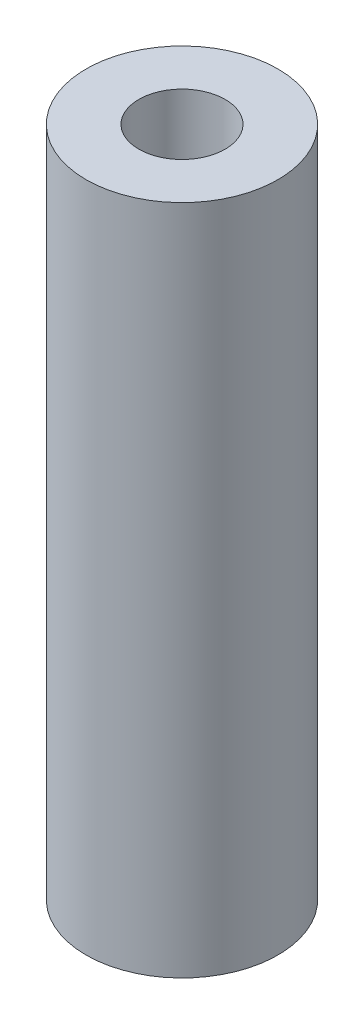
ISO-10303-21;
HEADER;
FILE_DESCRIPTION(('STEP AP214'),'2;1');
FILE_NAME('part.step','',(''),(''),'','','');
FILE_SCHEMA(('AUTOMOTIVE_DESIGN { 1 0 10303 214 1 1 1 1 }'));
ENDSEC;
DATA;
#1=APPLICATION_CONTEXT('core data for automotive mechanical design processes');
#2=APPLICATION_PROTOCOL_DEFINITION('international standard','automotive_design',2000,#1);
#3=PRODUCT_CONTEXT('',#1,'mechanical');
#4=PRODUCT('Part','Part','',(#3));
#5=PRODUCT_RELATED_PRODUCT_CATEGORY('part','',(#4));
#6=PRODUCT_DEFINITION_FORMATION('','',#4);
#7=PRODUCT_DEFINITION_CONTEXT('part definition',#1,'design');
#8=PRODUCT_DEFINITION('design','',#6,#7);
#9=PRODUCT_DEFINITION_SHAPE('','',#8);
#10=(LENGTH_UNIT() NAMED_UNIT(*) SI_UNIT(.MILLI.,.METRE.));
#11=(NAMED_UNIT(*) PLANE_ANGLE_UNIT() SI_UNIT($,.RADIAN.));
#12=(NAMED_UNIT(*) SI_UNIT($,.STERADIAN.) SOLID_ANGLE_UNIT());
#13=UNCERTAINTY_MEASURE_WITH_UNIT(LENGTH_MEASURE(1.E-05),#10,'distance_accuracy_value','');
#14=(GEOMETRIC_REPRESENTATION_CONTEXT(3) GLOBAL_UNCERTAINTY_ASSIGNED_CONTEXT((#13)) GLOBAL_UNIT_ASSIGNED_CONTEXT((#10,
#11,#12)) REPRESENTATION_CONTEXT('',''));
#15=CARTESIAN_POINT('',(0.,0.,0.));
#16=DIRECTION('',(0.,0.,1.));
#17=DIRECTION('',(1.,0.,0.));
#18=AXIS2_PLACEMENT_3D('',#15,#16,#17);
#19=CARTESIAN_POINT('',(0.,17.5,0.));
#20=DIRECTION('',(0.,-1.,0.));
#21=DIRECTION('',(0.,0.,-1.));
#22=AXIS2_PLACEMENT_3D('',#19,#20,#21);
#23=CYLINDRICAL_SURFACE('',#22,5.);
#24=CARTESIAN_POINT('',(0.,17.5,0.));
#25=DIRECTION('',(0.,1.,0.));
#26=DIRECTION('',(0.,0.,1.));
#27=AXIS2_PLACEMENT_3D('',#24,#25,#26);
#28=CIRCLE('',#27,5.);
#29=CARTESIAN_POINT('',(0.,17.5,5.));
#30=VERTEX_POINT('',#29);
#31=EDGE_CURVE('E12',#30,#30,#28,.T.);
#32=ORIENTED_EDGE('',*,*,#31,.F.);
#33=EDGE_LOOP('',(#32));
#34=FACE_BOUND('',#33,.T.);
#35=CARTESIAN_POINT('',(0.,-17.5,0.));
#36=DIRECTION('',(0.,1.,0.));
#37=DIRECTION('',(0.,0.,1.));
#38=AXIS2_PLACEMENT_3D('',#35,#36,#37);
#39=CIRCLE('',#38,5.);
#40=CARTESIAN_POINT('',(0.,-17.5,5.));
#41=VERTEX_POINT('',#40);
#42=EDGE_CURVE('E48',#41,#41,#39,.T.);
#43=ORIENTED_EDGE('',*,*,#42,.T.);
#44=EDGE_LOOP('',(#43));
#45=FACE_BOUND('',#44,.T.);
#46=ADVANCED_FACE('F45',(#34,#45),#23,.T.);
#47=CARTESIAN_POINT('',(0.,17.5,0.));
#48=DIRECTION('',(0.,1.,0.));
#49=DIRECTION('',(0.,0.,1.));
#50=AXIS2_PLACEMENT_3D('',#47,#48,#49);
#51=PLANE('',#50);
#52=CARTESIAN_POINT('',(0.,17.5,0.));
#53=DIRECTION('',(0.,1.,0.));
#54=DIRECTION('',(0.,0.,1.));
#55=AXIS2_PLACEMENT_3D('',#52,#53,#54);
#56=CIRCLE('',#55,2.24999999999999);
#57=CARTESIAN_POINT('',(0.,17.5,2.24999999999999));
#58=VERTEX_POINT('',#57);
#59=EDGE_CURVE('E59',#58,#58,#56,.T.);
#60=ORIENTED_EDGE('',*,*,#59,.F.);
#61=EDGE_LOOP('',(#60));
#62=FACE_BOUND('',#61,.T.);
#63=ORIENTED_EDGE('',*,*,#31,.T.);
#64=EDGE_LOOP('',(#63));
#65=FACE_BOUND('',#64,.T.);
#66=ADVANCED_FACE('F65',(#62,#65),#51,.T.);
#67=CARTESIAN_POINT('',(0.,-17.5,0.));
#68=DIRECTION('',(0.,1.,0.));
#69=DIRECTION('',(0.,0.,1.));
#70=AXIS2_PLACEMENT_3D('',#67,#68,#69);
#71=PLANE('',#70);
#72=CARTESIAN_POINT('',(0.,-17.5,0.));
#73=DIRECTION('',(0.,1.,0.));
#74=DIRECTION('',(0.,0.,1.));
#75=AXIS2_PLACEMENT_3D('',#72,#73,#74);
#76=CIRCLE('',#75,2.24999999999999);
#77=CARTESIAN_POINT('',(0.,-17.5,2.24999999999999));
#78=VERTEX_POINT('',#77);
#79=EDGE_CURVE('E55',#78,#78,#76,.T.);
#80=ORIENTED_EDGE('',*,*,#79,.T.);
#81=EDGE_LOOP('',(#80));
#82=FACE_BOUND('',#81,.T.);
#83=ORIENTED_EDGE('',*,*,#42,.F.);
#84=EDGE_LOOP('',(#83));
#85=FACE_BOUND('',#84,.T.);
#86=ADVANCED_FACE('F67',(#82,#85),#71,.F.);
#87=CARTESIAN_POINT('',(0.,17.5,0.));
#88=DIRECTION('',(0.,1.,0.));
#89=DIRECTION('',(0.,0.,1.));
#90=AXIS2_PLACEMENT_3D('',#87,#88,#89);
#91=CYLINDRICAL_SURFACE('',#90,2.24999999999999);
#92=ORIENTED_EDGE('',*,*,#79,.F.);
#93=EDGE_LOOP('',(#92));
#94=FACE_BOUND('',#93,.T.);
#95=ORIENTED_EDGE('',*,*,#59,.T.);
#96=EDGE_LOOP('',(#95));
#97=FACE_BOUND('',#96,.T.);
#98=ADVANCED_FACE('F63',(#94,#97),#91,.F.);
#99=CLOSED_SHELL('',(#46,#66,#86,#98));
#100=MANIFOLD_SOLID_BREP('B2',#99);
#101=ADVANCED_BREP_SHAPE_REPRESENTATION('',(#18,#100),#14);
#102=SHAPE_DEFINITION_REPRESENTATION(#9,#101);
ENDSEC;
END-ISO-10303-21;
